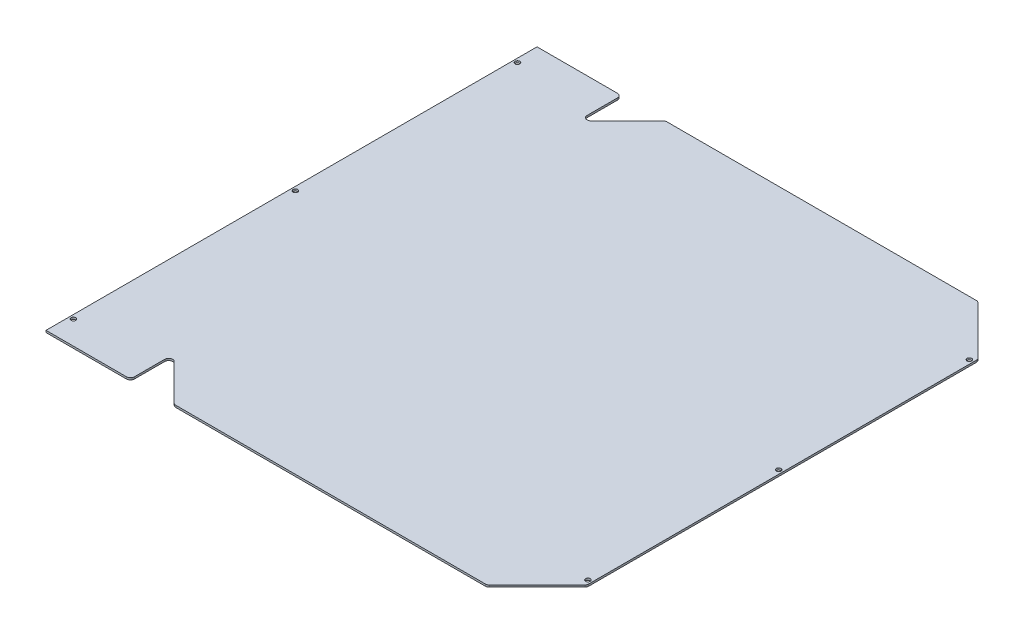
ISO-10303-21;
HEADER;
FILE_DESCRIPTION(('STEP AP214'),'2;1');
FILE_NAME('part.step','',(''),(''),'','','');
FILE_SCHEMA(('AUTOMOTIVE_DESIGN { 1 0 10303 214 1 1 1 1 }'));
ENDSEC;
DATA;
#1=APPLICATION_CONTEXT('core data for automotive mechanical design processes');
#2=APPLICATION_PROTOCOL_DEFINITION('international standard','automotive_design',2000,#1);
#3=PRODUCT_CONTEXT('',#1,'mechanical');
#4=PRODUCT('Part','Part','',(#3));
#5=PRODUCT_RELATED_PRODUCT_CATEGORY('part','',(#4));
#6=PRODUCT_DEFINITION_FORMATION('','',#4);
#7=PRODUCT_DEFINITION_CONTEXT('part definition',#1,'design');
#8=PRODUCT_DEFINITION('design','',#6,#7);
#9=PRODUCT_DEFINITION_SHAPE('','',#8);
#10=(LENGTH_UNIT() NAMED_UNIT(*) SI_UNIT(.MILLI.,.METRE.));
#11=(NAMED_UNIT(*) PLANE_ANGLE_UNIT() SI_UNIT($,.RADIAN.));
#12=(NAMED_UNIT(*) SI_UNIT($,.STERADIAN.) SOLID_ANGLE_UNIT());
#13=UNCERTAINTY_MEASURE_WITH_UNIT(LENGTH_MEASURE(1.E-05),#10,'distance_accuracy_value','');
#14=(GEOMETRIC_REPRESENTATION_CONTEXT(3) GLOBAL_UNCERTAINTY_ASSIGNED_CONTEXT((#13)) GLOBAL_UNIT_ASSIGNED_CONTEXT((#10,
#11,#12)) REPRESENTATION_CONTEXT('',''));
#15=CARTESIAN_POINT('',(0.,0.,0.));
#16=DIRECTION('',(0.,0.,1.));
#17=DIRECTION('',(1.,0.,0.));
#18=AXIS2_PLACEMENT_3D('',#15,#16,#17);
#19=CARTESIAN_POINT('',(0.,-1.5875,0.));
#20=DIRECTION('',(0.,1.,0.));
#21=DIRECTION('',(0.,0.,1.));
#22=AXIS2_PLACEMENT_3D('',#19,#20,#21);
#23=PLANE('',#22);
#24=CARTESIAN_POINT('',(-196.215,-1.5875,180.34));
#25=DIRECTION('',(0.,-1.,0.));
#26=DIRECTION('',(0.,0.,-1.));
#27=AXIS2_PLACEMENT_3D('',#24,#25,#26);
#28=CIRCLE('',#27,1.89865);
#29=CARTESIAN_POINT('',(-196.215,-1.5875,178.44135));
#30=VERTEX_POINT('',#29);
#31=EDGE_CURVE('E399',#30,#30,#28,.T.);
#32=ORIENTED_EDGE('',*,*,#31,.F.);
#33=EDGE_LOOP('',(#32));
#34=FACE_BOUND('',#33,.T.);
#35=CARTESIAN_POINT('',(196.215,-1.5875,154.94));
#36=DIRECTION('',(0.,-1.,0.));
#37=DIRECTION('',(0.,0.,-1.));
#38=AXIS2_PLACEMENT_3D('',#35,#36,#37);
#39=CIRCLE('',#38,1.89865);
#40=CARTESIAN_POINT('',(196.215,-1.5875,153.04135));
#41=VERTEX_POINT('',#40);
#42=EDGE_CURVE('E393',#41,#41,#39,.T.);
#43=ORIENTED_EDGE('',*,*,#42,.F.);
#44=EDGE_LOOP('',(#43));
#45=FACE_BOUND('',#44,.T.);
#46=CARTESIAN_POINT('',(196.215,-1.5875,-154.94));
#47=DIRECTION('',(0.,-1.,0.));
#48=DIRECTION('',(0.,0.,-1.));
#49=AXIS2_PLACEMENT_3D('',#46,#47,#48);
#50=CIRCLE('',#49,1.89865);
#51=CARTESIAN_POINT('',(196.215,-1.5875,-156.83865));
#52=VERTEX_POINT('',#51);
#53=EDGE_CURVE('E387',#52,#52,#50,.T.);
#54=ORIENTED_EDGE('',*,*,#53,.F.);
#55=EDGE_LOOP('',(#54));
#56=FACE_BOUND('',#55,.T.);
#57=CARTESIAN_POINT('',(-196.215,-1.5875,0.));
#58=DIRECTION('',(0.,-1.,0.));
#59=DIRECTION('',(0.,0.,-1.));
#60=AXIS2_PLACEMENT_3D('',#57,#58,#59);
#61=CIRCLE('',#60,1.89865);
#62=CARTESIAN_POINT('',(-196.215,-1.5875,-1.89865000000008));
#63=VERTEX_POINT('',#62);
#64=EDGE_CURVE('E381',#63,#63,#61,.T.);
#65=ORIENTED_EDGE('',*,*,#64,.F.);
#66=EDGE_LOOP('',(#65));
#67=FACE_BOUND('',#66,.T.);
#68=CARTESIAN_POINT('',(196.215,-1.5875,0.));
#69=DIRECTION('',(0.,-1.,0.));
#70=DIRECTION('',(0.,0.,-1.));
#71=AXIS2_PLACEMENT_3D('',#68,#69,#70);
#72=CIRCLE('',#71,1.89865);
#73=CARTESIAN_POINT('',(196.215,-1.5875,-1.89865));
#74=VERTEX_POINT('',#73);
#75=EDGE_CURVE('E375',#74,#74,#72,.T.);
#76=ORIENTED_EDGE('',*,*,#75,.F.);
#77=EDGE_LOOP('',(#76));
#78=FACE_BOUND('',#77,.T.);
#79=DIRECTION('',(1.,0.,0.));
#80=VECTOR('',#79,1.);
#81=CARTESIAN_POINT('',(0.,-1.5875,-199.39));
#82=LINE('',#81,#80);
#83=CARTESIAN_POINT('',(-93.9348719394656,-1.5875,-199.39));
#84=VERTEX_POINT('',#83);
#85=CARTESIAN_POINT('',(157.434871939465,-1.5875,-199.39));
#86=VERTEX_POINT('',#85);
#87=EDGE_CURVE('E211',#84,#86,#82,.T.);
#88=ORIENTED_EDGE('',*,*,#87,.T.);
#89=CARTESIAN_POINT('',(157.434871939465,-1.5875,-196.215));
#90=DIRECTION('',(0.,1.,0.));
#91=DIRECTION('',(0.,0.,1.));
#92=AXIS2_PLACEMENT_3D('',#89,#90,#91);
#93=CIRCLE('',#92,3.175);
#94=CARTESIAN_POINT('',(159.679935969733,-1.5875,-198.460064030267));
#95=VERTEX_POINT('',#94);
#96=EDGE_CURVE('E292',#86,#95,#93,.F.);
#97=ORIENTED_EDGE('',*,*,#96,.T.);
#98=DIRECTION('',(0.707106781186547,0.,0.707106781186549));
#99=VECTOR('',#98,1.);
#100=CARTESIAN_POINT('',(179.07,-1.5875,-179.07));
#101=LINE('',#100,#99);
#102=CARTESIAN_POINT('',(198.460064030267,-1.5875,-159.679935969733));
#103=VERTEX_POINT('',#102);
#104=EDGE_CURVE('E357',#95,#103,#101,.T.);
#105=ORIENTED_EDGE('',*,*,#104,.T.);
#106=CARTESIAN_POINT('',(196.215,-1.5875,-157.434871939465));
#107=DIRECTION('',(0.,1.,0.));
#108=DIRECTION('',(0.,0.,1.));
#109=AXIS2_PLACEMENT_3D('',#106,#107,#108);
#110=CIRCLE('',#109,3.175);
#111=CARTESIAN_POINT('',(199.39,-1.5875,-157.434871939465));
#112=VERTEX_POINT('',#111);
#113=EDGE_CURVE('E290',#103,#112,#110,.F.);
#114=ORIENTED_EDGE('',*,*,#113,.T.);
#115=DIRECTION('',(0.,0.,1.));
#116=VECTOR('',#115,1.);
#117=CARTESIAN_POINT('',(199.39,-1.5875,0.));
#118=LINE('',#117,#116);
#119=CARTESIAN_POINT('',(199.39,-1.5875,157.434871939465));
#120=VERTEX_POINT('',#119);
#121=EDGE_CURVE('E361',#112,#120,#118,.T.);
#122=ORIENTED_EDGE('',*,*,#121,.T.);
#123=CARTESIAN_POINT('',(196.215,-1.5875,157.434871939465));
#124=DIRECTION('',(0.,1.,0.));
#125=DIRECTION('',(0.,0.,1.));
#126=AXIS2_PLACEMENT_3D('',#123,#124,#125);
#127=CIRCLE('',#126,3.175);
#128=CARTESIAN_POINT('',(198.460064030267,-1.5875,159.679935969733));
#129=VERTEX_POINT('',#128);
#130=EDGE_CURVE('E288',#120,#129,#127,.F.);
#131=ORIENTED_EDGE('',*,*,#130,.T.);
#132=DIRECTION('',(0.707106781186547,0.,-0.707106781186549));
#133=VECTOR('',#132,1.);
#134=CARTESIAN_POINT('',(179.07,-1.5875,179.07));
#135=LINE('',#134,#133);
#136=CARTESIAN_POINT('',(159.679935969733,-1.5875,198.460064030267));
#137=VERTEX_POINT('',#136);
#138=EDGE_CURVE('E364',#137,#129,#135,.T.);
#139=ORIENTED_EDGE('',*,*,#138,.F.);
#140=CARTESIAN_POINT('',(157.434871939465,-1.5875,196.215));
#141=DIRECTION('',(0.,1.,0.));
#142=DIRECTION('',(0.,0.,1.));
#143=AXIS2_PLACEMENT_3D('',#140,#141,#142);
#144=CIRCLE('',#143,3.175);
#145=CARTESIAN_POINT('',(157.434871939465,-1.5875,199.39));
#146=VERTEX_POINT('',#145);
#147=EDGE_CURVE('E286',#137,#146,#144,.F.);
#148=ORIENTED_EDGE('',*,*,#147,.T.);
#149=DIRECTION('',(1.,0.,0.));
#150=VECTOR('',#149,1.);
#151=CARTESIAN_POINT('',(0.,-1.5875,199.39));
#152=LINE('',#151,#150);
#153=CARTESIAN_POINT('',(-93.9348719394658,-1.5875,199.39));
#154=VERTEX_POINT('',#153);
#155=EDGE_CURVE('E217',#154,#146,#152,.T.);
#156=ORIENTED_EDGE('',*,*,#155,.F.);
#157=CARTESIAN_POINT('',(-93.9348719394658,-1.5875,196.215));
#158=DIRECTION('',(0.,1.,0.));
#159=DIRECTION('',(0.,0.,1.));
#160=AXIS2_PLACEMENT_3D('',#157,#158,#159);
#161=CIRCLE('',#160,3.175);
#162=CARTESIAN_POINT('',(-96.1799359697331,-1.5875,198.460064030267));
#163=VERTEX_POINT('',#162);
#164=EDGE_CURVE('E54',#154,#163,#161,.F.);
#165=ORIENTED_EDGE('',*,*,#164,.T.);
#166=DIRECTION('',(0.707106781186544,0.,0.707106781186551));
#167=VECTOR('',#166,1.);
#168=CARTESIAN_POINT('',(-147.320000000001,-1.5875,147.319999999999));
#169=LINE('',#168,#167);
#170=CARTESIAN_POINT('',(-125.389935969733,-1.5875,169.250064030267));
#171=VERTEX_POINT('',#170);
#172=EDGE_CURVE('E368',#171,#163,#169,.T.);
#173=ORIENTED_EDGE('',*,*,#172,.F.);
#174=CARTESIAN_POINT('',(-127.635,-1.5875,171.495128060535));
#175=DIRECTION('',(0.,1.,0.));
#176=DIRECTION('',(0.,0.,1.));
#177=AXIS2_PLACEMENT_3D('',#174,#175,#176);
#178=CIRCLE('',#177,3.175);
#179=CARTESIAN_POINT('',(-130.81,-1.5875,171.495128060535));
#180=VERTEX_POINT('',#179);
#181=EDGE_CURVE('E334',#171,#180,#178,.T.);
#182=ORIENTED_EDGE('',*,*,#181,.T.);
#183=DIRECTION('',(0.,0.,-1.));
#184=VECTOR('',#183,1.);
#185=CARTESIAN_POINT('',(-130.81,-1.5875,0.));
#186=LINE('',#185,#184);
#187=CARTESIAN_POINT('',(-130.81,-1.5875,196.215));
#188=VERTEX_POINT('',#187);
#189=EDGE_CURVE('E370',#188,#180,#186,.T.);
#190=ORIENTED_EDGE('',*,*,#189,.F.);
#191=CARTESIAN_POINT('',(-133.985,-1.5875,196.215));
#192=DIRECTION('',(0.,1.,0.));
#193=DIRECTION('',(0.,0.,1.));
#194=AXIS2_PLACEMENT_3D('',#191,#192,#193);
#195=CIRCLE('',#194,3.175);
#196=CARTESIAN_POINT('',(-133.985,-1.5875,199.39));
#197=VERTEX_POINT('',#196);
#198=EDGE_CURVE('E284',#188,#197,#195,.F.);
#199=ORIENTED_EDGE('',*,*,#198,.T.);
#200=CARTESIAN_POINT('',(-199.39,-1.5875,199.39));
#201=VERTEX_POINT('',#200);
#202=EDGE_CURVE('E201',#201,#197,#152,.T.);
#203=ORIENTED_EDGE('',*,*,#202,.F.);
#204=DIRECTION('',(0.,0.,1.));
#205=VECTOR('',#204,1.);
#206=CARTESIAN_POINT('',(-199.39,-1.5875,0.));
#207=LINE('',#206,#205);
#208=CARTESIAN_POINT('',(-199.39,-1.5875,-199.39));
#209=VERTEX_POINT('',#208);
#210=EDGE_CURVE('E193',#209,#201,#207,.T.);
#211=ORIENTED_EDGE('',*,*,#210,.F.);
#212=CARTESIAN_POINT('',(-133.985,-1.5875,-199.39));
#213=VERTEX_POINT('',#212);
#214=EDGE_CURVE('E204',#209,#213,#82,.T.);
#215=ORIENTED_EDGE('',*,*,#214,.T.);
#216=CARTESIAN_POINT('',(-133.985,-1.5875,-196.215));
#217=DIRECTION('',(0.,1.,0.));
#218=DIRECTION('',(0.,0.,1.));
#219=AXIS2_PLACEMENT_3D('',#216,#217,#218);
#220=CIRCLE('',#219,3.175);
#221=CARTESIAN_POINT('',(-130.81,-1.5875,-196.215));
#222=VERTEX_POINT('',#221);
#223=EDGE_CURVE('E279',#213,#222,#220,.F.);
#224=ORIENTED_EDGE('',*,*,#223,.T.);
#225=DIRECTION('',(0.,0.,1.));
#226=VECTOR('',#225,1.);
#227=CARTESIAN_POINT('',(-130.81,-1.5875,0.));
#228=LINE('',#227,#226);
#229=CARTESIAN_POINT('',(-130.81,-1.5875,-171.495128060535));
#230=VERTEX_POINT('',#229);
#231=EDGE_CURVE('E209',#222,#230,#228,.T.);
#232=ORIENTED_EDGE('',*,*,#231,.T.);
#233=CARTESIAN_POINT('',(-127.635,-1.5875,-171.495128060535));
#234=DIRECTION('',(0.,1.,0.));
#235=DIRECTION('',(0.,0.,1.));
#236=AXIS2_PLACEMENT_3D('',#233,#234,#235);
#237=CIRCLE('',#236,3.175);
#238=CARTESIAN_POINT('',(-125.389935969733,-1.5875,-169.250064030267));
#239=VERTEX_POINT('',#238);
#240=EDGE_CURVE('E11',#230,#239,#237,.T.);
#241=ORIENTED_EDGE('',*,*,#240,.T.);
#242=DIRECTION('',(0.707106781186544,0.,-0.707106781186551));
#243=VECTOR('',#242,1.);
#244=CARTESIAN_POINT('',(-147.320000000001,-1.5875,-147.319999999999));
#245=LINE('',#244,#243);
#246=CARTESIAN_POINT('',(-96.179935969733,-1.5875,-198.460064030267));
#247=VERTEX_POINT('',#246);
#248=EDGE_CURVE('E352',#239,#247,#245,.T.);
#249=ORIENTED_EDGE('',*,*,#248,.T.);
#250=CARTESIAN_POINT('',(-93.9348719394656,-1.5875,-196.215));
#251=DIRECTION('',(0.,1.,0.));
#252=DIRECTION('',(0.,0.,1.));
#253=AXIS2_PLACEMENT_3D('',#250,#251,#252);
#254=CIRCLE('',#253,3.175);
#255=EDGE_CURVE('E281',#247,#84,#254,.F.);
#256=ORIENTED_EDGE('',*,*,#255,.T.);
#257=EDGE_LOOP('',(#88,#97,#105,#114,#122,#131,#139,#148,#156,#165,#173,#182,#190,#199,#203,
#211,#215,#224,#232,#241,#249,#256));
#258=FACE_BOUND('',#257,.T.);
#259=CARTESIAN_POINT('',(-196.215,-1.5875,-180.34));
#260=DIRECTION('',(0.,-1.,0.));
#261=DIRECTION('',(0.,0.,-1.));
#262=AXIS2_PLACEMENT_3D('',#259,#260,#261);
#263=CIRCLE('',#262,1.89865);
#264=CARTESIAN_POINT('',(-196.215,-1.5875,-182.23865));
#265=VERTEX_POINT('',#264);
#266=EDGE_CURVE('E405',#265,#265,#263,.T.);
#267=ORIENTED_EDGE('',*,*,#266,.F.);
#268=EDGE_LOOP('',(#267));
#269=FACE_BOUND('',#268,.T.);
#270=ADVANCED_FACE('F39',(#34,#45,#56,#67,#78,#258,#269),#23,.F.);
#271=CARTESIAN_POINT('',(0.,0.,0.));
#272=DIRECTION('',(0.,1.,0.));
#273=DIRECTION('',(0.,0.,1.));
#274=AXIS2_PLACEMENT_3D('',#271,#272,#273);
#275=PLANE('',#274);
#276=CARTESIAN_POINT('',(-196.215,0.,-180.34));
#277=DIRECTION('',(0.,-1.,0.));
#278=DIRECTION('',(0.,0.,-1.));
#279=AXIS2_PLACEMENT_3D('',#276,#277,#278);
#280=CIRCLE('',#279,1.89865);
#281=CARTESIAN_POINT('',(-196.215,0.,-182.23865));
#282=VERTEX_POINT('',#281);
#283=EDGE_CURVE('E402',#282,#282,#280,.T.);
#284=ORIENTED_EDGE('',*,*,#283,.T.);
#285=EDGE_LOOP('',(#284));
#286=FACE_BOUND('',#285,.T.);
#287=CARTESIAN_POINT('',(-196.215,0.,180.34));
#288=DIRECTION('',(0.,-1.,0.));
#289=DIRECTION('',(0.,0.,-1.));
#290=AXIS2_PLACEMENT_3D('',#287,#288,#289);
#291=CIRCLE('',#290,1.89865);
#292=CARTESIAN_POINT('',(-196.215,0.,178.44135));
#293=VERTEX_POINT('',#292);
#294=EDGE_CURVE('E396',#293,#293,#291,.T.);
#295=ORIENTED_EDGE('',*,*,#294,.T.);
#296=EDGE_LOOP('',(#295));
#297=FACE_BOUND('',#296,.T.);
#298=CARTESIAN_POINT('',(196.215,0.,154.94));
#299=DIRECTION('',(0.,-1.,0.));
#300=DIRECTION('',(0.,0.,-1.));
#301=AXIS2_PLACEMENT_3D('',#298,#299,#300);
#302=CIRCLE('',#301,1.89865);
#303=CARTESIAN_POINT('',(196.215,0.,153.04135));
#304=VERTEX_POINT('',#303);
#305=EDGE_CURVE('E390',#304,#304,#302,.T.);
#306=ORIENTED_EDGE('',*,*,#305,.T.);
#307=EDGE_LOOP('',(#306));
#308=FACE_BOUND('',#307,.T.);
#309=CARTESIAN_POINT('',(196.215,0.,-154.94));
#310=DIRECTION('',(0.,-1.,0.));
#311=DIRECTION('',(0.,0.,-1.));
#312=AXIS2_PLACEMENT_3D('',#309,#310,#311);
#313=CIRCLE('',#312,1.89865);
#314=CARTESIAN_POINT('',(196.215,0.,-156.83865));
#315=VERTEX_POINT('',#314);
#316=EDGE_CURVE('E384',#315,#315,#313,.T.);
#317=ORIENTED_EDGE('',*,*,#316,.T.);
#318=EDGE_LOOP('',(#317));
#319=FACE_BOUND('',#318,.T.);
#320=CARTESIAN_POINT('',(-196.215,0.,0.));
#321=DIRECTION('',(0.,-1.,0.));
#322=DIRECTION('',(0.,0.,-1.));
#323=AXIS2_PLACEMENT_3D('',#320,#321,#322);
#324=CIRCLE('',#323,1.89865);
#325=CARTESIAN_POINT('',(-196.215,0.,-1.89865000000008));
#326=VERTEX_POINT('',#325);
#327=EDGE_CURVE('E378',#326,#326,#324,.T.);
#328=ORIENTED_EDGE('',*,*,#327,.T.);
#329=EDGE_LOOP('',(#328));
#330=FACE_BOUND('',#329,.T.);
#331=DIRECTION('',(0.707106781186547,0.,0.707106781186549));
#332=VECTOR('',#331,1.);
#333=CARTESIAN_POINT('',(179.07,0.,-179.07));
#334=LINE('',#333,#332);
#335=CARTESIAN_POINT('',(159.679935969733,0.,-198.460064030267));
#336=VERTEX_POINT('',#335);
#337=CARTESIAN_POINT('',(198.460064030267,0.,-159.679935969733));
#338=VERTEX_POINT('',#337);
#339=EDGE_CURVE('E238',#336,#338,#334,.T.);
#340=ORIENTED_EDGE('',*,*,#339,.F.);
#341=CARTESIAN_POINT('',(157.434871939465,0.,-196.215));
#342=DIRECTION('',(0.,1.,0.));
#343=DIRECTION('',(0.,0.,1.));
#344=AXIS2_PLACEMENT_3D('',#341,#342,#343);
#345=CIRCLE('',#344,3.175);
#346=CARTESIAN_POINT('',(157.434871939465,0.,-199.39));
#347=VERTEX_POINT('',#346);
#348=EDGE_CURVE('E272',#336,#347,#345,.T.);
#349=ORIENTED_EDGE('',*,*,#348,.T.);
#350=DIRECTION('',(1.,0.,0.));
#351=VECTOR('',#350,1.);
#352=CARTESIAN_POINT('',(0.,0.,-199.39));
#353=LINE('',#352,#351);
#354=CARTESIAN_POINT('',(-93.9348719394656,0.,-199.39));
#355=VERTEX_POINT('',#354);
#356=EDGE_CURVE('E241',#355,#347,#353,.T.);
#357=ORIENTED_EDGE('',*,*,#356,.F.);
#358=CARTESIAN_POINT('',(-93.9348719394656,0.,-196.215));
#359=DIRECTION('',(0.,1.,0.));
#360=DIRECTION('',(0.,0.,1.));
#361=AXIS2_PLACEMENT_3D('',#358,#359,#360);
#362=CIRCLE('',#361,3.175);
#363=CARTESIAN_POINT('',(-96.179935969733,0.,-198.460064030267));
#364=VERTEX_POINT('',#363);
#365=EDGE_CURVE('E260',#355,#364,#362,.T.);
#366=ORIENTED_EDGE('',*,*,#365,.T.);
#367=DIRECTION('',(0.707106781186544,0.,-0.707106781186551));
#368=VECTOR('',#367,1.);
#369=CARTESIAN_POINT('',(-147.320000000001,0.,-147.319999999999));
#370=LINE('',#369,#368);
#371=CARTESIAN_POINT('',(-125.389935969733,0.,-169.250064030267));
#372=VERTEX_POINT('',#371);
#373=EDGE_CURVE('E244',#372,#364,#370,.T.);
#374=ORIENTED_EDGE('',*,*,#373,.F.);
#375=CARTESIAN_POINT('',(-127.635,0.,-171.495128060535));
#376=DIRECTION('',(0.,1.,0.));
#377=DIRECTION('',(0.,0.,1.));
#378=AXIS2_PLACEMENT_3D('',#375,#376,#377);
#379=CIRCLE('',#378,3.175);
#380=CARTESIAN_POINT('',(-130.81,0.,-171.495128060535));
#381=VERTEX_POINT('',#380);
#382=EDGE_CURVE('E47',#372,#381,#379,.F.);
#383=ORIENTED_EDGE('',*,*,#382,.T.);
#384=DIRECTION('',(0.,0.,1.));
#385=VECTOR('',#384,1.);
#386=CARTESIAN_POINT('',(-130.81,0.,0.));
#387=LINE('',#386,#385);
#388=CARTESIAN_POINT('',(-130.81,0.,-196.215));
#389=VERTEX_POINT('',#388);
#390=EDGE_CURVE('E248',#389,#381,#387,.T.);
#391=ORIENTED_EDGE('',*,*,#390,.F.);
#392=CARTESIAN_POINT('',(-133.985,0.,-196.215));
#393=DIRECTION('',(0.,1.,0.));
#394=DIRECTION('',(0.,0.,1.));
#395=AXIS2_PLACEMENT_3D('',#392,#393,#394);
#396=CIRCLE('',#395,3.175);
#397=CARTESIAN_POINT('',(-133.985,0.,-199.39));
#398=VERTEX_POINT('',#397);
#399=EDGE_CURVE('E258',#389,#398,#396,.T.);
#400=ORIENTED_EDGE('',*,*,#399,.T.);
#401=CARTESIAN_POINT('',(-199.39,0.,-199.39));
#402=VERTEX_POINT('',#401);
#403=EDGE_CURVE('E245',#402,#398,#353,.T.);
#404=ORIENTED_EDGE('',*,*,#403,.F.);
#405=DIRECTION('',(0.,0.,1.));
#406=VECTOR('',#405,1.);
#407=CARTESIAN_POINT('',(-199.39,0.,0.));
#408=LINE('',#407,#406);
#409=CARTESIAN_POINT('',(-199.39,0.,199.39));
#410=VERTEX_POINT('',#409);
#411=EDGE_CURVE('E196',#402,#410,#408,.T.);
#412=ORIENTED_EDGE('',*,*,#411,.T.);
#413=DIRECTION('',(1.,0.,0.));
#414=VECTOR('',#413,1.);
#415=CARTESIAN_POINT('',(0.,0.,199.39));
#416=LINE('',#415,#414);
#417=CARTESIAN_POINT('',(-133.985,0.,199.39));
#418=VERTEX_POINT('',#417);
#419=EDGE_CURVE('E232',#410,#418,#416,.T.);
#420=ORIENTED_EDGE('',*,*,#419,.T.);
#421=CARTESIAN_POINT('',(-133.985,0.,196.215));
#422=DIRECTION('',(0.,1.,0.));
#423=DIRECTION('',(0.,0.,1.));
#424=AXIS2_PLACEMENT_3D('',#421,#422,#423);
#425=CIRCLE('',#424,3.175);
#426=CARTESIAN_POINT('',(-130.81,0.,196.215));
#427=VERTEX_POINT('',#426);
#428=EDGE_CURVE('E264',#418,#427,#425,.T.);
#429=ORIENTED_EDGE('',*,*,#428,.T.);
#430=DIRECTION('',(0.,0.,-1.));
#431=VECTOR('',#430,1.);
#432=CARTESIAN_POINT('',(-130.81,0.,0.));
#433=LINE('',#432,#431);
#434=CARTESIAN_POINT('',(-130.81,0.,171.495128060535));
#435=VERTEX_POINT('',#434);
#436=EDGE_CURVE('E221',#427,#435,#433,.T.);
#437=ORIENTED_EDGE('',*,*,#436,.T.);
#438=CARTESIAN_POINT('',(-127.635,0.,171.495128060535));
#439=DIRECTION('',(0.,1.,0.));
#440=DIRECTION('',(0.,0.,1.));
#441=AXIS2_PLACEMENT_3D('',#438,#439,#440);
#442=CIRCLE('',#441,3.175);
#443=CARTESIAN_POINT('',(-125.389935969733,0.,169.250064030267));
#444=VERTEX_POINT('',#443);
#445=EDGE_CURVE('E332',#435,#444,#442,.F.);
#446=ORIENTED_EDGE('',*,*,#445,.T.);
#447=DIRECTION('',(0.707106781186544,0.,0.707106781186551));
#448=VECTOR('',#447,1.);
#449=CARTESIAN_POINT('',(-147.320000000001,0.,147.319999999999));
#450=LINE('',#449,#448);
#451=CARTESIAN_POINT('',(-96.1799359697331,0.,198.460064030267));
#452=VERTEX_POINT('',#451);
#453=EDGE_CURVE('E224',#444,#452,#450,.T.);
#454=ORIENTED_EDGE('',*,*,#453,.T.);
#455=CARTESIAN_POINT('',(-93.9348719394658,0.,196.215));
#456=DIRECTION('',(0.,1.,0.));
#457=DIRECTION('',(0.,0.,1.));
#458=AXIS2_PLACEMENT_3D('',#455,#456,#457);
#459=CIRCLE('',#458,3.175);
#460=CARTESIAN_POINT('',(-93.9348719394658,0.,199.39));
#461=VERTEX_POINT('',#460);
#462=EDGE_CURVE('E262',#452,#461,#459,.T.);
#463=ORIENTED_EDGE('',*,*,#462,.T.);
#464=CARTESIAN_POINT('',(157.434871939465,0.,199.39));
#465=VERTEX_POINT('',#464);
#466=EDGE_CURVE('E228',#461,#465,#416,.T.);
#467=ORIENTED_EDGE('',*,*,#466,.T.);
#468=CARTESIAN_POINT('',(157.434871939465,0.,196.215));
#469=DIRECTION('',(0.,1.,0.));
#470=DIRECTION('',(0.,0.,1.));
#471=AXIS2_PLACEMENT_3D('',#468,#469,#470);
#472=CIRCLE('',#471,3.175);
#473=CARTESIAN_POINT('',(159.679935969733,0.,198.460064030267));
#474=VERTEX_POINT('',#473);
#475=EDGE_CURVE('E266',#465,#474,#472,.T.);
#476=ORIENTED_EDGE('',*,*,#475,.T.);
#477=DIRECTION('',(0.707106781186547,0.,-0.707106781186549));
#478=VECTOR('',#477,1.);
#479=CARTESIAN_POINT('',(179.07,0.,179.07));
#480=LINE('',#479,#478);
#481=CARTESIAN_POINT('',(198.460064030267,0.,159.679935969733));
#482=VERTEX_POINT('',#481);
#483=EDGE_CURVE('E231',#474,#482,#480,.T.);
#484=ORIENTED_EDGE('',*,*,#483,.T.);
#485=CARTESIAN_POINT('',(196.215,0.,157.434871939465));
#486=DIRECTION('',(0.,1.,0.));
#487=DIRECTION('',(0.,0.,1.));
#488=AXIS2_PLACEMENT_3D('',#485,#486,#487);
#489=CIRCLE('',#488,3.175);
#490=CARTESIAN_POINT('',(199.39,0.,157.434871939465));
#491=VERTEX_POINT('',#490);
#492=EDGE_CURVE('E268',#482,#491,#489,.T.);
#493=ORIENTED_EDGE('',*,*,#492,.T.);
#494=DIRECTION('',(0.,0.,1.));
#495=VECTOR('',#494,1.);
#496=CARTESIAN_POINT('',(199.39,0.,0.));
#497=LINE('',#496,#495);
#498=CARTESIAN_POINT('',(199.39,0.,-157.434871939465));
#499=VERTEX_POINT('',#498);
#500=EDGE_CURVE('E235',#499,#491,#497,.T.);
#501=ORIENTED_EDGE('',*,*,#500,.F.);
#502=CARTESIAN_POINT('',(196.215,0.,-157.434871939465));
#503=DIRECTION('',(0.,1.,0.));
#504=DIRECTION('',(0.,0.,1.));
#505=AXIS2_PLACEMENT_3D('',#502,#503,#504);
#506=CIRCLE('',#505,3.175);
#507=EDGE_CURVE('E270',#499,#338,#506,.T.);
#508=ORIENTED_EDGE('',*,*,#507,.T.);
#509=EDGE_LOOP('',(#340,#349,#357,#366,#374,#383,#391,#400,#404,#412,#420,#429,#437,#446,#454,
#463,#467,#476,#484,#493,#501,#508));
#510=FACE_BOUND('',#509,.T.);
#511=CARTESIAN_POINT('',(196.215,0.,0.));
#512=DIRECTION('',(0.,-1.,0.));
#513=DIRECTION('',(0.,0.,-1.));
#514=AXIS2_PLACEMENT_3D('',#511,#512,#513);
#515=CIRCLE('',#514,1.89865);
#516=CARTESIAN_POINT('',(196.215,0.,-1.89865));
#517=VERTEX_POINT('',#516);
#518=EDGE_CURVE('E225',#517,#517,#515,.T.);
#519=ORIENTED_EDGE('',*,*,#518,.T.);
#520=EDGE_LOOP('',(#519));
#521=FACE_BOUND('',#520,.T.);
#522=ADVANCED_FACE('F339',(#286,#297,#308,#319,#330,#510,#521),#275,.T.);
#523=CARTESIAN_POINT('',(-130.81,-1.5875,0.));
#524=DIRECTION('',(1.,0.,0.));
#525=DIRECTION('',(0.,0.,-1.));
#526=AXIS2_PLACEMENT_3D('',#523,#524,#525);
#527=PLANE('',#526);
#528=ORIENTED_EDGE('',*,*,#189,.T.);
#529=DIRECTION('',(0.,1.,0.));
#530=VECTOR('',#529,1.);
#531=CARTESIAN_POINT('',(-130.81,0.,171.495128060535));
#532=LINE('',#531,#530);
#533=EDGE_CURVE('E311',#180,#435,#532,.T.);
#534=ORIENTED_EDGE('',*,*,#533,.T.);
#535=ORIENTED_EDGE('',*,*,#436,.F.);
#536=DIRECTION('',(0.,1.,0.));
#537=VECTOR('',#536,1.);
#538=CARTESIAN_POINT('',(-130.81,-1.5875,196.215));
#539=LINE('',#538,#537);
#540=EDGE_CURVE('E309',#427,#188,#539,.F.);
#541=ORIENTED_EDGE('',*,*,#540,.T.);
#542=EDGE_LOOP('',(#528,#534,#535,#541));
#543=FACE_BOUND('',#542,.T.);
#544=ADVANCED_FACE('F416',(#543),#527,.T.);
#545=CARTESIAN_POINT('',(0.,-1.5875,199.39));
#546=DIRECTION('',(0.,0.,1.));
#547=DIRECTION('',(1.,0.,0.));
#548=AXIS2_PLACEMENT_3D('',#545,#546,#547);
#549=PLANE('',#548);
#550=ORIENTED_EDGE('',*,*,#202,.T.);
#551=DIRECTION('',(0.,1.,0.));
#552=VECTOR('',#551,1.);
#553=CARTESIAN_POINT('',(-133.985,-1.5875,199.39));
#554=LINE('',#553,#552);
#555=EDGE_CURVE('E318',#197,#418,#554,.T.);
#556=ORIENTED_EDGE('',*,*,#555,.T.);
#557=ORIENTED_EDGE('',*,*,#419,.F.);
#558=DIRECTION('',(0.,1.,0.));
#559=VECTOR('',#558,1.);
#560=CARTESIAN_POINT('',(-199.39,-1.5875,199.39));
#561=LINE('',#560,#559);
#562=EDGE_CURVE('E200',#201,#410,#561,.T.);
#563=ORIENTED_EDGE('',*,*,#562,.F.);
#564=EDGE_LOOP('',(#550,#556,#557,#563));
#565=FACE_BOUND('',#564,.T.);
#566=ADVANCED_FACE('F425',(#565),#549,.T.);
#567=CARTESIAN_POINT('',(-199.39,-1.5875,0.));
#568=DIRECTION('',(-1.,0.,0.));
#569=DIRECTION('',(0.,0.,1.));
#570=AXIS2_PLACEMENT_3D('',#567,#568,#569);
#571=PLANE('',#570);
#572=ORIENTED_EDGE('',*,*,#411,.F.);
#573=DIRECTION('',(0.,1.,0.));
#574=VECTOR('',#573,1.);
#575=CARTESIAN_POINT('',(-199.39,-1.5875,-199.39));
#576=LINE('',#575,#574);
#577=EDGE_CURVE('E189',#209,#402,#576,.T.);
#578=ORIENTED_EDGE('',*,*,#577,.F.);
#579=ORIENTED_EDGE('',*,*,#210,.T.);
#580=ORIENTED_EDGE('',*,*,#562,.T.);
#581=EDGE_LOOP('',(#572,#578,#579,#580));
#582=FACE_BOUND('',#581,.T.);
#583=ADVANCED_FACE('F191',(#582),#571,.T.);
#584=CARTESIAN_POINT('',(0.,-1.5875,-199.39));
#585=DIRECTION('',(0.,0.,1.));
#586=DIRECTION('',(1.,0.,0.));
#587=AXIS2_PLACEMENT_3D('',#584,#585,#586);
#588=PLANE('',#587);
#589=ORIENTED_EDGE('',*,*,#403,.T.);
#590=DIRECTION('',(0.,1.,0.));
#591=VECTOR('',#590,1.);
#592=CARTESIAN_POINT('',(-133.985,-1.5875,-199.39));
#593=LINE('',#592,#591);
#594=EDGE_CURVE('E207',#398,#213,#593,.F.);
#595=ORIENTED_EDGE('',*,*,#594,.T.);
#596=ORIENTED_EDGE('',*,*,#214,.F.);
#597=ORIENTED_EDGE('',*,*,#577,.T.);
#598=EDGE_LOOP('',(#589,#595,#596,#597));
#599=FACE_BOUND('',#598,.T.);
#600=ADVANCED_FACE('F205',(#599),#588,.F.);
#601=CARTESIAN_POINT('',(-130.81,-1.5875,0.));
#602=DIRECTION('',(-1.,0.,0.));
#603=DIRECTION('',(0.,0.,1.));
#604=AXIS2_PLACEMENT_3D('',#601,#602,#603);
#605=PLANE('',#604);
#606=ORIENTED_EDGE('',*,*,#231,.F.);
#607=DIRECTION('',(0.,1.,0.));
#608=VECTOR('',#607,1.);
#609=CARTESIAN_POINT('',(-130.81,-1.5875,-196.215));
#610=LINE('',#609,#608);
#611=EDGE_CURVE('E328',#222,#389,#610,.T.);
#612=ORIENTED_EDGE('',*,*,#611,.T.);
#613=ORIENTED_EDGE('',*,*,#390,.T.);
#614=DIRECTION('',(0.,1.,0.));
#615=VECTOR('',#614,1.);
#616=CARTESIAN_POINT('',(-130.81,-1.5875,-171.495128060535));
#617=LINE('',#616,#615);
#618=EDGE_CURVE('E326',#381,#230,#617,.F.);
#619=ORIENTED_EDGE('',*,*,#618,.T.);
#620=EDGE_LOOP('',(#606,#612,#613,#619));
#621=FACE_BOUND('',#620,.T.);
#622=ADVANCED_FACE('F346',(#621),#605,.F.);
#623=CARTESIAN_POINT('',(-147.320000000001,-1.5875,-147.319999999999));
#624=DIRECTION('',(0.707106781186551,0.,0.707106781186544));
#625=DIRECTION('',(0.707106781186544,0.,-0.707106781186551));
#626=AXIS2_PLACEMENT_3D('',#623,#624,#625);
#627=PLANE('',#626);
#628=ORIENTED_EDGE('',*,*,#373,.T.);
#629=DIRECTION('',(0.,1.,0.));
#630=VECTOR('',#629,1.);
#631=CARTESIAN_POINT('',(-96.179935969733,-1.5875,-198.460064030267));
#632=LINE('',#631,#630);
#633=EDGE_CURVE('E324',#364,#247,#632,.F.);
#634=ORIENTED_EDGE('',*,*,#633,.T.);
#635=ORIENTED_EDGE('',*,*,#248,.F.);
#636=DIRECTION('',(0.,1.,0.));
#637=VECTOR('',#636,1.);
#638=CARTESIAN_POINT('',(-125.389935969733,0.,-169.250064030267));
#639=LINE('',#638,#637);
#640=EDGE_CURVE('E321',#239,#372,#639,.T.);
#641=ORIENTED_EDGE('',*,*,#640,.T.);
#642=EDGE_LOOP('',(#628,#634,#635,#641));
#643=FACE_BOUND('',#642,.T.);
#644=ADVANCED_FACE('F355',(#643),#627,.F.);
#645=ORIENTED_EDGE('',*,*,#356,.T.);
#646=DIRECTION('',(0.,1.,0.));
#647=VECTOR('',#646,1.);
#648=CARTESIAN_POINT('',(157.434871939465,-1.5875,-199.39));
#649=LINE('',#648,#647);
#650=EDGE_CURVE('E277',#347,#86,#649,.F.);
#651=ORIENTED_EDGE('',*,*,#650,.T.);
#652=ORIENTED_EDGE('',*,*,#87,.F.);
#653=DIRECTION('',(0.,1.,0.));
#654=VECTOR('',#653,1.);
#655=CARTESIAN_POINT('',(-93.9348719394656,-1.5875,-199.39));
#656=LINE('',#655,#654);
#657=EDGE_CURVE('E274',#84,#355,#656,.T.);
#658=ORIENTED_EDGE('',*,*,#657,.T.);
#659=EDGE_LOOP('',(#645,#651,#652,#658));
#660=FACE_BOUND('',#659,.T.);
#661=ADVANCED_FACE('F434',(#660),#588,.F.);
#662=CARTESIAN_POINT('',(179.07,-1.5875,-179.07));
#663=DIRECTION('',(-0.707106781186548,0.,0.707106781186547));
#664=DIRECTION('',(0.707106781186547,0.,0.707106781186548));
#665=AXIS2_PLACEMENT_3D('',#662,#663,#664);
#666=PLANE('',#665);
#667=ORIENTED_EDGE('',*,*,#104,.F.);
#668=DIRECTION('',(0.,1.,0.));
#669=VECTOR('',#668,1.);
#670=CARTESIAN_POINT('',(159.679935969733,-1.5875,-198.460064030267));
#671=LINE('',#670,#669);
#672=EDGE_CURVE('E255',#95,#336,#671,.T.);
#673=ORIENTED_EDGE('',*,*,#672,.T.);
#674=ORIENTED_EDGE('',*,*,#339,.T.);
#675=DIRECTION('',(0.,1.,0.));
#676=VECTOR('',#675,1.);
#677=CARTESIAN_POINT('',(198.460064030267,-1.5875,-159.679935969733));
#678=LINE('',#677,#676);
#679=EDGE_CURVE('E252',#338,#103,#678,.F.);
#680=ORIENTED_EDGE('',*,*,#679,.T.);
#681=EDGE_LOOP('',(#667,#673,#674,#680));
#682=FACE_BOUND('',#681,.T.);
#683=ADVANCED_FACE('F439',(#682),#666,.F.);
#684=CARTESIAN_POINT('',(199.39,-1.5875,0.));
#685=DIRECTION('',(-1.,0.,0.));
#686=DIRECTION('',(0.,0.,1.));
#687=AXIS2_PLACEMENT_3D('',#684,#685,#686);
#688=PLANE('',#687);
#689=ORIENTED_EDGE('',*,*,#121,.F.);
#690=DIRECTION('',(0.,1.,0.));
#691=VECTOR('',#690,1.);
#692=CARTESIAN_POINT('',(199.39,-1.5875,-157.434871939465));
#693=LINE('',#692,#691);
#694=EDGE_CURVE('E296',#112,#499,#693,.T.);
#695=ORIENTED_EDGE('',*,*,#694,.T.);
#696=ORIENTED_EDGE('',*,*,#500,.T.);
#697=DIRECTION('',(0.,1.,0.));
#698=VECTOR('',#697,1.);
#699=CARTESIAN_POINT('',(199.39,-1.5875,157.434871939465));
#700=LINE('',#699,#698);
#701=EDGE_CURVE('E294',#491,#120,#700,.F.);
#702=ORIENTED_EDGE('',*,*,#701,.T.);
#703=EDGE_LOOP('',(#689,#695,#696,#702));
#704=FACE_BOUND('',#703,.T.);
#705=ADVANCED_FACE('F442',(#704),#688,.F.);
#706=CARTESIAN_POINT('',(179.07,-1.5875,179.07));
#707=DIRECTION('',(0.707106781186548,0.,0.707106781186547));
#708=DIRECTION('',(0.707106781186547,0.,-0.707106781186548));
#709=AXIS2_PLACEMENT_3D('',#706,#707,#708);
#710=PLANE('',#709);
#711=ORIENTED_EDGE('',*,*,#138,.T.);
#712=DIRECTION('',(0.,1.,0.));
#713=VECTOR('',#712,1.);
#714=CARTESIAN_POINT('',(198.460064030267,0.,159.679935969733));
#715=LINE('',#714,#713);
#716=EDGE_CURVE('E301',#129,#482,#715,.T.);
#717=ORIENTED_EDGE('',*,*,#716,.T.);
#718=ORIENTED_EDGE('',*,*,#483,.F.);
#719=DIRECTION('',(0.,1.,0.));
#720=VECTOR('',#719,1.);
#721=CARTESIAN_POINT('',(159.679935969733,-1.5875,198.460064030267));
#722=LINE('',#721,#720);
#723=EDGE_CURVE('E299',#474,#137,#722,.F.);
#724=ORIENTED_EDGE('',*,*,#723,.T.);
#725=EDGE_LOOP('',(#711,#717,#718,#724));
#726=FACE_BOUND('',#725,.T.);
#727=ADVANCED_FACE('F446',(#726),#710,.T.);
#728=ORIENTED_EDGE('',*,*,#155,.T.);
#729=DIRECTION('',(0.,1.,0.));
#730=VECTOR('',#729,1.);
#731=CARTESIAN_POINT('',(157.434871939465,-1.5875,199.39));
#732=LINE('',#731,#730);
#733=EDGE_CURVE('E306',#146,#465,#732,.T.);
#734=ORIENTED_EDGE('',*,*,#733,.T.);
#735=ORIENTED_EDGE('',*,*,#466,.F.);
#736=DIRECTION('',(0.,1.,0.));
#737=VECTOR('',#736,1.);
#738=CARTESIAN_POINT('',(-93.9348719394658,-1.5875,199.39));
#739=LINE('',#738,#737);
#740=EDGE_CURVE('E304',#461,#154,#739,.F.);
#741=ORIENTED_EDGE('',*,*,#740,.T.);
#742=EDGE_LOOP('',(#728,#734,#735,#741));
#743=FACE_BOUND('',#742,.T.);
#744=ADVANCED_FACE('F429',(#743),#549,.T.);
#745=CARTESIAN_POINT('',(-147.320000000001,-1.5875,147.319999999999));
#746=DIRECTION('',(-0.707106781186551,0.,0.707106781186544));
#747=DIRECTION('',(0.707106781186544,0.,0.707106781186551));
#748=AXIS2_PLACEMENT_3D('',#745,#746,#747);
#749=PLANE('',#748);
#750=ORIENTED_EDGE('',*,*,#453,.F.);
#751=DIRECTION('',(0.,1.,0.));
#752=VECTOR('',#751,1.);
#753=CARTESIAN_POINT('',(-125.389935969733,-1.5875,169.250064030267));
#754=LINE('',#753,#752);
#755=EDGE_CURVE('E61',#444,#171,#754,.F.);
#756=ORIENTED_EDGE('',*,*,#755,.T.);
#757=ORIENTED_EDGE('',*,*,#172,.T.);
#758=DIRECTION('',(0.,1.,0.));
#759=VECTOR('',#758,1.);
#760=CARTESIAN_POINT('',(-96.1799359697331,-1.5875,198.460064030267));
#761=LINE('',#760,#759);
#762=EDGE_CURVE('E314',#163,#452,#761,.T.);
#763=ORIENTED_EDGE('',*,*,#762,.T.);
#764=EDGE_LOOP('',(#750,#756,#757,#763));
#765=FACE_BOUND('',#764,.T.);
#766=ADVANCED_FACE('F451',(#765),#749,.T.);
#767=CARTESIAN_POINT('',(196.215,-1.5875,0.));
#768=DIRECTION('',(0.,-1.,0.));
#769=DIRECTION('',(0.,0.,-1.));
#770=AXIS2_PLACEMENT_3D('',#767,#768,#769);
#771=CYLINDRICAL_SURFACE('',#770,1.89865);
#772=ORIENTED_EDGE('',*,*,#518,.F.);
#773=EDGE_LOOP('',(#772));
#774=FACE_BOUND('',#773,.T.);
#775=ORIENTED_EDGE('',*,*,#75,.T.);
#776=EDGE_LOOP('',(#775));
#777=FACE_BOUND('',#776,.T.);
#778=ADVANCED_FACE('F422',(#774,#777),#771,.F.);
#779=CARTESIAN_POINT('',(-196.215,-1.5875,0.));
#780=DIRECTION('',(0.,-1.,0.));
#781=DIRECTION('',(0.,0.,-1.));
#782=AXIS2_PLACEMENT_3D('',#779,#780,#781);
#783=CYLINDRICAL_SURFACE('',#782,1.89865);
#784=ORIENTED_EDGE('',*,*,#327,.F.);
#785=EDGE_LOOP('',(#784));
#786=FACE_BOUND('',#785,.T.);
#787=ORIENTED_EDGE('',*,*,#64,.T.);
#788=EDGE_LOOP('',(#787));
#789=FACE_BOUND('',#788,.T.);
#790=ADVANCED_FACE('F561',(#786,#789),#783,.F.);
#791=CARTESIAN_POINT('',(196.215,-1.5875,-154.94));
#792=DIRECTION('',(0.,-1.,0.));
#793=DIRECTION('',(0.,0.,-1.));
#794=AXIS2_PLACEMENT_3D('',#791,#792,#793);
#795=CYLINDRICAL_SURFACE('',#794,1.89865);
#796=ORIENTED_EDGE('',*,*,#316,.F.);
#797=EDGE_LOOP('',(#796));
#798=FACE_BOUND('',#797,.T.);
#799=ORIENTED_EDGE('',*,*,#53,.T.);
#800=EDGE_LOOP('',(#799));
#801=FACE_BOUND('',#800,.T.);
#802=ADVANCED_FACE('F569',(#798,#801),#795,.F.);
#803=CARTESIAN_POINT('',(196.215,-1.5875,154.94));
#804=DIRECTION('',(0.,-1.,0.));
#805=DIRECTION('',(0.,0.,-1.));
#806=AXIS2_PLACEMENT_3D('',#803,#804,#805);
#807=CYLINDRICAL_SURFACE('',#806,1.89865);
#808=ORIENTED_EDGE('',*,*,#305,.F.);
#809=EDGE_LOOP('',(#808));
#810=FACE_BOUND('',#809,.T.);
#811=ORIENTED_EDGE('',*,*,#42,.T.);
#812=EDGE_LOOP('',(#811));
#813=FACE_BOUND('',#812,.T.);
#814=ADVANCED_FACE('F576',(#810,#813),#807,.F.);
#815=CARTESIAN_POINT('',(-196.215,-1.5875,180.34));
#816=DIRECTION('',(0.,-1.,0.));
#817=DIRECTION('',(0.,0.,-1.));
#818=AXIS2_PLACEMENT_3D('',#815,#816,#817);
#819=CYLINDRICAL_SURFACE('',#818,1.89865);
#820=ORIENTED_EDGE('',*,*,#294,.F.);
#821=EDGE_LOOP('',(#820));
#822=FACE_BOUND('',#821,.T.);
#823=ORIENTED_EDGE('',*,*,#31,.T.);
#824=EDGE_LOOP('',(#823));
#825=FACE_BOUND('',#824,.T.);
#826=ADVANCED_FACE('F584',(#822,#825),#819,.F.);
#827=CARTESIAN_POINT('',(-196.215,-1.5875,-180.34));
#828=DIRECTION('',(0.,-1.,0.));
#829=DIRECTION('',(0.,0.,-1.));
#830=AXIS2_PLACEMENT_3D('',#827,#828,#829);
#831=CYLINDRICAL_SURFACE('',#830,1.89865);
#832=ORIENTED_EDGE('',*,*,#283,.F.);
#833=EDGE_LOOP('',(#832));
#834=FACE_BOUND('',#833,.T.);
#835=ORIENTED_EDGE('',*,*,#266,.T.);
#836=EDGE_LOOP('',(#835));
#837=FACE_BOUND('',#836,.T.);
#838=ADVANCED_FACE('F409',(#834,#837),#831,.F.);
#839=CARTESIAN_POINT('',(157.434871939465,-1.5875,-196.215));
#840=DIRECTION('',(0.,1.,0.));
#841=DIRECTION('',(0.,0.,1.));
#842=AXIS2_PLACEMENT_3D('',#839,#840,#841);
#843=CYLINDRICAL_SURFACE('',#842,3.175);
#844=ORIENTED_EDGE('',*,*,#96,.F.);
#845=ORIENTED_EDGE('',*,*,#650,.F.);
#846=ORIENTED_EDGE('',*,*,#348,.F.);
#847=ORIENTED_EDGE('',*,*,#672,.F.);
#848=EDGE_LOOP('',(#844,#845,#846,#847));
#849=FACE_BOUND('',#848,.T.);
#850=ADVANCED_FACE('F457',(#849),#843,.T.);
#851=CARTESIAN_POINT('',(196.215,-1.5875,-157.434871939465));
#852=DIRECTION('',(0.,1.,0.));
#853=DIRECTION('',(0.,0.,1.));
#854=AXIS2_PLACEMENT_3D('',#851,#852,#853);
#855=CYLINDRICAL_SURFACE('',#854,3.175);
#856=ORIENTED_EDGE('',*,*,#113,.F.);
#857=ORIENTED_EDGE('',*,*,#679,.F.);
#858=ORIENTED_EDGE('',*,*,#507,.F.);
#859=ORIENTED_EDGE('',*,*,#694,.F.);
#860=EDGE_LOOP('',(#856,#857,#858,#859));
#861=FACE_BOUND('',#860,.T.);
#862=ADVANCED_FACE('F460',(#861),#855,.T.);
#863=CARTESIAN_POINT('',(196.215,-1.5875,157.434871939465));
#864=DIRECTION('',(0.,-1.,0.));
#865=DIRECTION('',(0.,0.,-1.));
#866=AXIS2_PLACEMENT_3D('',#863,#864,#865);
#867=CYLINDRICAL_SURFACE('',#866,3.175);
#868=ORIENTED_EDGE('',*,*,#130,.F.);
#869=ORIENTED_EDGE('',*,*,#701,.F.);
#870=ORIENTED_EDGE('',*,*,#492,.F.);
#871=ORIENTED_EDGE('',*,*,#716,.F.);
#872=EDGE_LOOP('',(#868,#869,#870,#871));
#873=FACE_BOUND('',#872,.T.);
#874=ADVANCED_FACE('F464',(#873),#867,.T.);
#875=CARTESIAN_POINT('',(157.434871939465,-1.5875,196.215));
#876=DIRECTION('',(0.,1.,0.));
#877=DIRECTION('',(0.,0.,1.));
#878=AXIS2_PLACEMENT_3D('',#875,#876,#877);
#879=CYLINDRICAL_SURFACE('',#878,3.175);
#880=ORIENTED_EDGE('',*,*,#147,.F.);
#881=ORIENTED_EDGE('',*,*,#723,.F.);
#882=ORIENTED_EDGE('',*,*,#475,.F.);
#883=ORIENTED_EDGE('',*,*,#733,.F.);
#884=EDGE_LOOP('',(#880,#881,#882,#883));
#885=FACE_BOUND('',#884,.T.);
#886=ADVANCED_FACE('F468',(#885),#879,.T.);
#887=CARTESIAN_POINT('',(-127.635,-1.5875,171.495128060535));
#888=DIRECTION('',(0.,-1.,0.));
#889=DIRECTION('',(0.,0.,-1.));
#890=AXIS2_PLACEMENT_3D('',#887,#888,#889);
#891=CYLINDRICAL_SURFACE('',#890,3.175);
#892=ORIENTED_EDGE('',*,*,#181,.F.);
#893=ORIENTED_EDGE('',*,*,#755,.F.);
#894=ORIENTED_EDGE('',*,*,#445,.F.);
#895=ORIENTED_EDGE('',*,*,#533,.F.);
#896=EDGE_LOOP('',(#892,#893,#894,#895));
#897=FACE_BOUND('',#896,.T.);
#898=ADVANCED_FACE('F472',(#897),#891,.F.);
#899=CARTESIAN_POINT('',(-133.985,-1.5875,196.215));
#900=DIRECTION('',(0.,1.,0.));
#901=DIRECTION('',(0.,0.,1.));
#902=AXIS2_PLACEMENT_3D('',#899,#900,#901);
#903=CYLINDRICAL_SURFACE('',#902,3.175);
#904=ORIENTED_EDGE('',*,*,#198,.F.);
#905=ORIENTED_EDGE('',*,*,#540,.F.);
#906=ORIENTED_EDGE('',*,*,#428,.F.);
#907=ORIENTED_EDGE('',*,*,#555,.F.);
#908=EDGE_LOOP('',(#904,#905,#906,#907));
#909=FACE_BOUND('',#908,.T.);
#910=ADVANCED_FACE('F476',(#909),#903,.T.);
#911=CARTESIAN_POINT('',(-93.9348719394658,-1.5875,196.215));
#912=DIRECTION('',(0.,1.,0.));
#913=DIRECTION('',(0.,0.,1.));
#914=AXIS2_PLACEMENT_3D('',#911,#912,#913);
#915=CYLINDRICAL_SURFACE('',#914,3.175);
#916=ORIENTED_EDGE('',*,*,#164,.F.);
#917=ORIENTED_EDGE('',*,*,#740,.F.);
#918=ORIENTED_EDGE('',*,*,#462,.F.);
#919=ORIENTED_EDGE('',*,*,#762,.F.);
#920=EDGE_LOOP('',(#916,#917,#918,#919));
#921=FACE_BOUND('',#920,.T.);
#922=ADVANCED_FACE('F480',(#921),#915,.T.);
#923=CARTESIAN_POINT('',(-93.9348719394656,-1.5875,-196.215));
#924=DIRECTION('',(0.,1.,0.));
#925=DIRECTION('',(0.,0.,1.));
#926=AXIS2_PLACEMENT_3D('',#923,#924,#925);
#927=CYLINDRICAL_SURFACE('',#926,3.175);
#928=ORIENTED_EDGE('',*,*,#255,.F.);
#929=ORIENTED_EDGE('',*,*,#633,.F.);
#930=ORIENTED_EDGE('',*,*,#365,.F.);
#931=ORIENTED_EDGE('',*,*,#657,.F.);
#932=EDGE_LOOP('',(#928,#929,#930,#931));
#933=FACE_BOUND('',#932,.T.);
#934=ADVANCED_FACE('F484',(#933),#927,.T.);
#935=CARTESIAN_POINT('',(-133.985,-1.5875,-196.215));
#936=DIRECTION('',(0.,1.,0.));
#937=DIRECTION('',(0.,0.,1.));
#938=AXIS2_PLACEMENT_3D('',#935,#936,#937);
#939=CYLINDRICAL_SURFACE('',#938,3.175);
#940=ORIENTED_EDGE('',*,*,#223,.F.);
#941=ORIENTED_EDGE('',*,*,#594,.F.);
#942=ORIENTED_EDGE('',*,*,#399,.F.);
#943=ORIENTED_EDGE('',*,*,#611,.F.);
#944=EDGE_LOOP('',(#940,#941,#942,#943));
#945=FACE_BOUND('',#944,.T.);
#946=ADVANCED_FACE('F487',(#945),#939,.T.);
#947=CARTESIAN_POINT('',(-127.635,-1.5875,-171.495128060535));
#948=DIRECTION('',(0.,-1.,0.));
#949=DIRECTION('',(0.,0.,-1.));
#950=AXIS2_PLACEMENT_3D('',#947,#948,#949);
#951=CYLINDRICAL_SURFACE('',#950,3.175);
#952=ORIENTED_EDGE('',*,*,#240,.F.);
#953=ORIENTED_EDGE('',*,*,#618,.F.);
#954=ORIENTED_EDGE('',*,*,#382,.F.);
#955=ORIENTED_EDGE('',*,*,#640,.F.);
#956=EDGE_LOOP('',(#952,#953,#954,#955));
#957=FACE_BOUND('',#956,.T.);
#958=ADVANCED_FACE('F41',(#957),#951,.F.);
#959=CLOSED_SHELL('',(#270,#522,#544,#566,#583,#600,#622,#644,#661,#683,#705,#727,#744,#766,
#778,#790,#802,#814,#826,#838,#850,#862,#874,#886,#898,#910,#922,#934,#946,#958));
#960=MANIFOLD_SOLID_BREP('B2',#959);
#961=ADVANCED_BREP_SHAPE_REPRESENTATION('',(#18,#960),#14);
#962=SHAPE_DEFINITION_REPRESENTATION(#9,#961);
ENDSEC;
END-ISO-10303-21;
